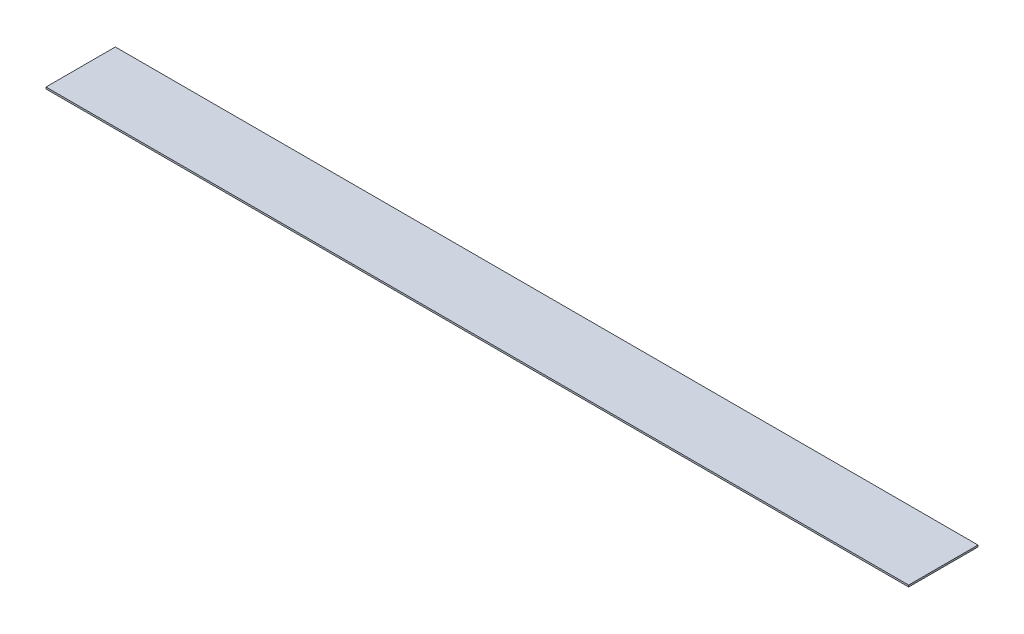
ISO-10303-21;
HEADER;
FILE_DESCRIPTION(('STEP AP214'),'2;1');
FILE_NAME('part.step','',(''),(''),'','','');
FILE_SCHEMA(('AUTOMOTIVE_DESIGN { 1 0 10303 214 1 1 1 1 }'));
ENDSEC;
DATA;
#1=APPLICATION_CONTEXT('core data for automotive mechanical design processes');
#2=APPLICATION_PROTOCOL_DEFINITION('international standard','automotive_design',2000,#1);
#3=PRODUCT_CONTEXT('',#1,'mechanical');
#4=PRODUCT('Part','Part','',(#3));
#5=PRODUCT_RELATED_PRODUCT_CATEGORY('part','',(#4));
#6=PRODUCT_DEFINITION_FORMATION('','',#4);
#7=PRODUCT_DEFINITION_CONTEXT('part definition',#1,'design');
#8=PRODUCT_DEFINITION('design','',#6,#7);
#9=PRODUCT_DEFINITION_SHAPE('','',#8);
#10=(LENGTH_UNIT() NAMED_UNIT(*) SI_UNIT(.MILLI.,.METRE.));
#11=(NAMED_UNIT(*) PLANE_ANGLE_UNIT() SI_UNIT($,.RADIAN.));
#12=(NAMED_UNIT(*) SI_UNIT($,.STERADIAN.) SOLID_ANGLE_UNIT());
#13=UNCERTAINTY_MEASURE_WITH_UNIT(LENGTH_MEASURE(1.E-05),#10,'distance_accuracy_value','');
#14=(GEOMETRIC_REPRESENTATION_CONTEXT(3) GLOBAL_UNCERTAINTY_ASSIGNED_CONTEXT((#13)) GLOBAL_UNIT_ASSIGNED_CONTEXT((#10,
#11,#12)) REPRESENTATION_CONTEXT('',''));
#15=CARTESIAN_POINT('',(0.,0.,0.));
#16=DIRECTION('',(0.,0.,1.));
#17=DIRECTION('',(1.,0.,0.));
#18=AXIS2_PLACEMENT_3D('',#15,#16,#17);
#19=CARTESIAN_POINT('',(-789.999999999998,1.5875,-63.5000000000001));
#20=DIRECTION('',(0.,0.,-1.));
#21=DIRECTION('',(-1.,0.,0.));
#22=AXIS2_PLACEMENT_3D('',#19,#20,#21);
#23=PLANE('',#22);
#24=DIRECTION('',(1.,0.,0.));
#25=VECTOR('',#24,1.);
#26=CARTESIAN_POINT('',(-789.999999999998,1.5875,-63.5000000000001));
#27=LINE('',#26,#25);
#28=CARTESIAN_POINT('',(-789.999999999998,1.5875,-63.5000000000001));
#29=VERTEX_POINT('',#28);
#30=CARTESIAN_POINT('',(790.000000000002,1.5875,-63.5000000000001));
#31=VERTEX_POINT('',#30);
#32=EDGE_CURVE('E48',#29,#31,#27,.T.);
#33=ORIENTED_EDGE('',*,*,#32,.T.);
#34=DIRECTION('',(0.,1.,0.));
#35=VECTOR('',#34,1.);
#36=CARTESIAN_POINT('',(790.000000000002,1.5875,-63.5000000000001));
#37=LINE('',#36,#35);
#38=CARTESIAN_POINT('',(790.000000000002,-1.58749999999998,-63.5000000000001));
#39=VERTEX_POINT('',#38);
#40=EDGE_CURVE('E86',#39,#31,#37,.T.);
#41=ORIENTED_EDGE('',*,*,#40,.F.);
#42=DIRECTION('',(1.,0.,0.));
#43=VECTOR('',#42,1.);
#44=CARTESIAN_POINT('',(-789.999999999998,-1.58749999999998,-63.5000000000001));
#45=LINE('',#44,#43);
#46=CARTESIAN_POINT('',(-789.999999999998,-1.58749999999998,-63.5000000000001));
#47=VERTEX_POINT('',#46);
#48=EDGE_CURVE('E11',#47,#39,#45,.T.);
#49=ORIENTED_EDGE('',*,*,#48,.F.);
#50=DIRECTION('',(0.,1.,0.));
#51=VECTOR('',#50,1.);
#52=CARTESIAN_POINT('',(-789.999999999998,1.5875,-63.5000000000001));
#53=LINE('',#52,#51);
#54=EDGE_CURVE('E87',#47,#29,#53,.T.);
#55=ORIENTED_EDGE('',*,*,#54,.T.);
#56=EDGE_LOOP('',(#33,#41,#49,#55));
#57=FACE_BOUND('',#56,.T.);
#58=ADVANCED_FACE('F45',(#57),#23,.T.);
#59=CARTESIAN_POINT('',(-789.999999999998,-1.58749999999998,-63.5000000000001));
#60=DIRECTION('',(0.,-1.,0.));
#61=DIRECTION('',(0.,0.,-1.));
#62=AXIS2_PLACEMENT_3D('',#59,#60,#61);
#63=PLANE('',#62);
#64=ORIENTED_EDGE('',*,*,#48,.T.);
#65=DIRECTION('',(0.,0.,-1.));
#66=VECTOR('',#65,1.);
#67=CARTESIAN_POINT('',(790.000000000002,-1.58749999999998,-63.5000000000001));
#68=LINE('',#67,#66);
#69=CARTESIAN_POINT('',(790.000000000002,-1.5875,63.5000000000001));
#70=VERTEX_POINT('',#69);
#71=EDGE_CURVE('E105',#70,#39,#68,.T.);
#72=ORIENTED_EDGE('',*,*,#71,.F.);
#73=DIRECTION('',(1.,0.,0.));
#74=VECTOR('',#73,1.);
#75=CARTESIAN_POINT('',(-789.999999999998,-1.5875,63.5000000000001));
#76=LINE('',#75,#74);
#77=CARTESIAN_POINT('',(-789.999999999998,-1.5875,63.5000000000001));
#78=VERTEX_POINT('',#77);
#79=EDGE_CURVE('E54',#78,#70,#76,.T.);
#80=ORIENTED_EDGE('',*,*,#79,.F.);
#81=DIRECTION('',(0.,0.,-1.));
#82=VECTOR('',#81,1.);
#83=CARTESIAN_POINT('',(-789.999999999998,-1.58749999999998,-63.5000000000001));
#84=LINE('',#83,#82);
#85=EDGE_CURVE('E93',#78,#47,#84,.T.);
#86=ORIENTED_EDGE('',*,*,#85,.T.);
#87=EDGE_LOOP('',(#64,#72,#80,#86));
#88=FACE_BOUND('',#87,.T.);
#89=ADVANCED_FACE('F129',(#88),#63,.T.);
#90=CARTESIAN_POINT('',(-789.999999999998,1.58749999999998,63.5000000000001));
#91=DIRECTION('',(0.,0.,1.));
#92=DIRECTION('',(1.,0.,0.));
#93=AXIS2_PLACEMENT_3D('',#90,#91,#92);
#94=PLANE('',#93);
#95=ORIENTED_EDGE('',*,*,#79,.T.);
#96=DIRECTION('',(0.,-1.,0.));
#97=VECTOR('',#96,1.);
#98=CARTESIAN_POINT('',(790.000000000002,1.58749999999998,63.5000000000001));
#99=LINE('',#98,#97);
#100=CARTESIAN_POINT('',(790.000000000002,1.58749999999998,63.5000000000001));
#101=VERTEX_POINT('',#100);
#102=EDGE_CURVE('E101',#101,#70,#99,.T.);
#103=ORIENTED_EDGE('',*,*,#102,.F.);
#104=DIRECTION('',(1.,0.,0.));
#105=VECTOR('',#104,1.);
#106=CARTESIAN_POINT('',(-789.999999999998,1.58749999999998,63.5000000000001));
#107=LINE('',#106,#105);
#108=CARTESIAN_POINT('',(-789.999999999998,1.58749999999998,63.5000000000001));
#109=VERTEX_POINT('',#108);
#110=EDGE_CURVE('E92',#109,#101,#107,.T.);
#111=ORIENTED_EDGE('',*,*,#110,.F.);
#112=DIRECTION('',(0.,-1.,0.));
#113=VECTOR('',#112,1.);
#114=CARTESIAN_POINT('',(-789.999999999998,1.58749999999998,63.5000000000001));
#115=LINE('',#114,#113);
#116=EDGE_CURVE('E118',#109,#78,#115,.T.);
#117=ORIENTED_EDGE('',*,*,#116,.T.);
#118=EDGE_LOOP('',(#95,#103,#111,#117));
#119=FACE_BOUND('',#118,.T.);
#120=ADVANCED_FACE('F126',(#119),#94,.T.);
#121=CARTESIAN_POINT('',(-789.999999999998,1.5875,-63.5000000000001));
#122=DIRECTION('',(0.,1.,0.));
#123=DIRECTION('',(0.,0.,1.));
#124=AXIS2_PLACEMENT_3D('',#121,#122,#123);
#125=PLANE('',#124);
#126=ORIENTED_EDGE('',*,*,#110,.T.);
#127=DIRECTION('',(0.,0.,1.));
#128=VECTOR('',#127,1.);
#129=CARTESIAN_POINT('',(790.000000000002,1.5875,-63.5000000000001));
#130=LINE('',#129,#128);
#131=EDGE_CURVE('E95',#31,#101,#130,.T.);
#132=ORIENTED_EDGE('',*,*,#131,.F.);
#133=ORIENTED_EDGE('',*,*,#32,.F.);
#134=DIRECTION('',(0.,0.,1.));
#135=VECTOR('',#134,1.);
#136=CARTESIAN_POINT('',(-789.999999999998,1.5875,-63.5000000000001));
#137=LINE('',#136,#135);
#138=EDGE_CURVE('E115',#29,#109,#137,.T.);
#139=ORIENTED_EDGE('',*,*,#138,.T.);
#140=EDGE_LOOP('',(#126,#132,#133,#139));
#141=FACE_BOUND('',#140,.T.);
#142=ADVANCED_FACE('F96',(#141),#125,.T.);
#143=CARTESIAN_POINT('',(-789.999999999998,0.,0.));
#144=DIRECTION('',(-1.,0.,0.));
#145=DIRECTION('',(0.,0.,1.));
#146=AXIS2_PLACEMENT_3D('',#143,#144,#145);
#147=PLANE('',#146);
#148=ORIENTED_EDGE('',*,*,#54,.F.);
#149=ORIENTED_EDGE('',*,*,#85,.F.);
#150=ORIENTED_EDGE('',*,*,#116,.F.);
#151=ORIENTED_EDGE('',*,*,#138,.F.);
#152=EDGE_LOOP('',(#148,#149,#150,#151));
#153=FACE_BOUND('',#152,.T.);
#154=ADVANCED_FACE('F131',(#153),#147,.T.);
#155=CARTESIAN_POINT('',(790.000000000002,0.,0.));
#156=DIRECTION('',(-1.,0.,0.));
#157=DIRECTION('',(0.,0.,1.));
#158=AXIS2_PLACEMENT_3D('',#155,#156,#157);
#159=PLANE('',#158);
#160=ORIENTED_EDGE('',*,*,#40,.T.);
#161=ORIENTED_EDGE('',*,*,#131,.T.);
#162=ORIENTED_EDGE('',*,*,#102,.T.);
#163=ORIENTED_EDGE('',*,*,#71,.T.);
#164=EDGE_LOOP('',(#160,#161,#162,#163));
#165=FACE_BOUND('',#164,.T.);
#166=ADVANCED_FACE('F104',(#165),#159,.F.);
#167=CLOSED_SHELL('',(#58,#89,#120,#142,#154,#166));
#168=MANIFOLD_SOLID_BREP('B2',#167);
#169=ADVANCED_BREP_SHAPE_REPRESENTATION('',(#18,#168),#14);
#170=SHAPE_DEFINITION_REPRESENTATION(#9,#169);
ENDSEC;
END-ISO-10303-21;
